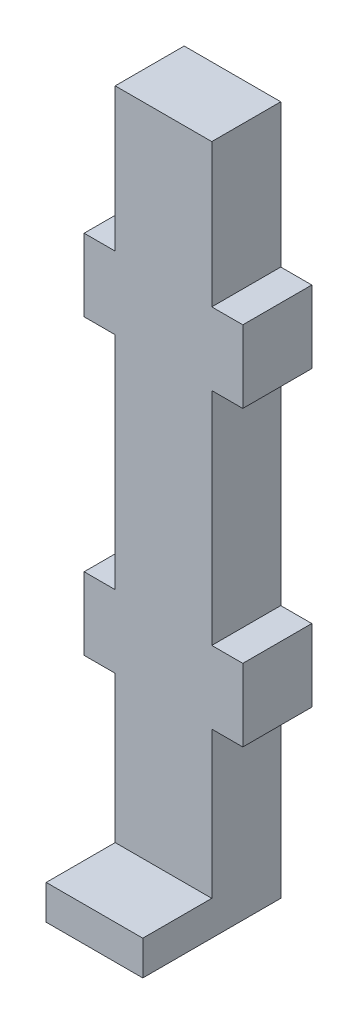
ISO-10303-21;
HEADER;
FILE_DESCRIPTION(('STEP AP214'),'2;1');
FILE_NAME('part.step','',(''),(''),'','','');
FILE_SCHEMA(('AUTOMOTIVE_DESIGN { 1 0 10303 214 1 1 1 1 }'));
ENDSEC;
DATA;
#1=APPLICATION_CONTEXT('core data for automotive mechanical design processes');
#2=APPLICATION_PROTOCOL_DEFINITION('international standard','automotive_design',2000,#1);
#3=PRODUCT_CONTEXT('',#1,'mechanical');
#4=PRODUCT('Part','Part','',(#3));
#5=PRODUCT_RELATED_PRODUCT_CATEGORY('part','',(#4));
#6=PRODUCT_DEFINITION_FORMATION('','',#4);
#7=PRODUCT_DEFINITION_CONTEXT('part definition',#1,'design');
#8=PRODUCT_DEFINITION('design','',#6,#7);
#9=PRODUCT_DEFINITION_SHAPE('','',#8);
#10=(LENGTH_UNIT() NAMED_UNIT(*) SI_UNIT(.MILLI.,.METRE.));
#11=(NAMED_UNIT(*) PLANE_ANGLE_UNIT() SI_UNIT($,.RADIAN.));
#12=(NAMED_UNIT(*) SI_UNIT($,.STERADIAN.) SOLID_ANGLE_UNIT());
#13=UNCERTAINTY_MEASURE_WITH_UNIT(LENGTH_MEASURE(1.E-05),#10,'distance_accuracy_value','');
#14=(GEOMETRIC_REPRESENTATION_CONTEXT(3) GLOBAL_UNCERTAINTY_ASSIGNED_CONTEXT((#13)) GLOBAL_UNIT_ASSIGNED_CONTEXT((#10,
#11,#12)) REPRESENTATION_CONTEXT('',''));
#15=CARTESIAN_POINT('',(0.,0.,0.));
#16=DIRECTION('',(0.,0.,1.));
#17=DIRECTION('',(1.,0.,0.));
#18=AXIS2_PLACEMENT_3D('',#15,#16,#17);
#19=CARTESIAN_POINT('',(2.8,-20.,4.));
#20=DIRECTION('',(-1.,0.,0.));
#21=DIRECTION('',(0.,0.,1.));
#22=AXIS2_PLACEMENT_3D('',#19,#20,#21);
#23=PLANE('',#22);
#24=DIRECTION('',(0.,0.,1.));
#25=VECTOR('',#24,1.);
#26=CARTESIAN_POINT('',(2.8,-5.3,0.));
#27=LINE('',#26,#25);
#28=CARTESIAN_POINT('',(2.8,-5.3,0.));
#29=VERTEX_POINT('',#28);
#30=CARTESIAN_POINT('',(2.8,-5.3,4.));
#31=VERTEX_POINT('',#30);
#32=EDGE_CURVE('E432',#29,#31,#27,.T.);
#33=ORIENTED_EDGE('',*,*,#32,.F.);
#34=DIRECTION('',(0.,1.,0.));
#35=VECTOR('',#34,1.);
#36=CARTESIAN_POINT('',(2.8,-20.,0.));
#37=LINE('',#36,#35);
#38=CARTESIAN_POINT('',(2.8,7.5,0.));
#39=VERTEX_POINT('',#38);
#40=EDGE_CURVE('E222',#29,#39,#37,.T.);
#41=ORIENTED_EDGE('',*,*,#40,.T.);
#42=DIRECTION('',(0.,0.,1.));
#43=VECTOR('',#42,1.);
#44=CARTESIAN_POINT('',(2.8,7.5,0.));
#45=LINE('',#44,#43);
#46=CARTESIAN_POINT('',(2.8,7.5,4.));
#47=VERTEX_POINT('',#46);
#48=EDGE_CURVE('E273',#39,#47,#45,.T.);
#49=ORIENTED_EDGE('',*,*,#48,.T.);
#50=DIRECTION('',(0.,1.,0.));
#51=VECTOR('',#50,1.);
#52=CARTESIAN_POINT('',(2.8,-20.,4.));
#53=LINE('',#52,#51);
#54=EDGE_CURVE('E61',#31,#47,#53,.T.);
#55=ORIENTED_EDGE('',*,*,#54,.F.);
#56=EDGE_LOOP('',(#33,#41,#49,#55));
#57=FACE_BOUND('',#56,.T.);
#58=ADVANCED_FACE('F45',(#57),#23,.F.);
#59=DIRECTION('',(0.,0.,-1.));
#60=VECTOR('',#59,1.);
#61=CARTESIAN_POINT('',(2.8,-9.5,0.));
#62=LINE('',#61,#60);
#63=CARTESIAN_POINT('',(2.8,-9.5,4.));
#64=VERTEX_POINT('',#63);
#65=CARTESIAN_POINT('',(2.8,-9.5,0.));
#66=VERTEX_POINT('',#65);
#67=EDGE_CURVE('E69',#64,#66,#62,.T.);
#68=ORIENTED_EDGE('',*,*,#67,.F.);
#69=CARTESIAN_POINT('',(2.8,-18.,4.));
#70=VERTEX_POINT('',#69);
#71=EDGE_CURVE('E367',#70,#64,#53,.T.);
#72=ORIENTED_EDGE('',*,*,#71,.F.);
#73=DIRECTION('',(0.,0.,-1.));
#74=VECTOR('',#73,1.);
#75=CARTESIAN_POINT('',(2.8,-18.,8.));
#76=LINE('',#75,#74);
#77=CARTESIAN_POINT('',(2.8,-18.,8.));
#78=VERTEX_POINT('',#77);
#79=EDGE_CURVE('E362',#78,#70,#76,.T.);
#80=ORIENTED_EDGE('',*,*,#79,.F.);
#81=DIRECTION('',(0.,1.,0.));
#82=VECTOR('',#81,1.);
#83=CARTESIAN_POINT('',(2.8,-20.,8.));
#84=LINE('',#83,#82);
#85=CARTESIAN_POINT('',(2.8,-20.,8.));
#86=VERTEX_POINT('',#85);
#87=EDGE_CURVE('E349',#86,#78,#84,.T.);
#88=ORIENTED_EDGE('',*,*,#87,.F.);
#89=DIRECTION('',(0.,0.,-1.));
#90=VECTOR('',#89,1.);
#91=CARTESIAN_POINT('',(2.8,-20.,4.));
#92=LINE('',#91,#90);
#93=CARTESIAN_POINT('',(2.8,-20.,0.));
#94=VERTEX_POINT('',#93);
#95=EDGE_CURVE('E11',#86,#94,#92,.T.);
#96=ORIENTED_EDGE('',*,*,#95,.T.);
#97=EDGE_CURVE('E386',#94,#66,#37,.T.);
#98=ORIENTED_EDGE('',*,*,#97,.T.);
#99=EDGE_LOOP('',(#68,#72,#80,#88,#96,#98));
#100=FACE_BOUND('',#99,.T.);
#101=ADVANCED_FACE('F484',(#100),#23,.F.);
#102=CARTESIAN_POINT('',(-2.8,-20.,4.));
#103=DIRECTION('',(-1.,0.,0.));
#104=DIRECTION('',(0.,0.,1.));
#105=AXIS2_PLACEMENT_3D('',#102,#103,#104);
#106=PLANE('',#105);
#107=DIRECTION('',(0.,0.,-1.));
#108=VECTOR('',#107,1.);
#109=CARTESIAN_POINT('',(-2.8,-9.5,0.));
#110=LINE('',#109,#108);
#111=CARTESIAN_POINT('',(-2.8,-9.5,4.));
#112=VERTEX_POINT('',#111);
#113=CARTESIAN_POINT('',(-2.8,-9.5,0.));
#114=VERTEX_POINT('',#113);
#115=EDGE_CURVE('E224',#112,#114,#110,.T.);
#116=ORIENTED_EDGE('',*,*,#115,.T.);
#117=DIRECTION('',(0.,1.,0.));
#118=VECTOR('',#117,1.);
#119=CARTESIAN_POINT('',(-2.8,-20.,0.));
#120=LINE('',#119,#118);
#121=CARTESIAN_POINT('',(-2.8,-20.,0.));
#122=VERTEX_POINT('',#121);
#123=EDGE_CURVE('E394',#122,#114,#120,.T.);
#124=ORIENTED_EDGE('',*,*,#123,.F.);
#125=DIRECTION('',(0.,0.,-1.));
#126=VECTOR('',#125,1.);
#127=CARTESIAN_POINT('',(-2.8,-20.,4.));
#128=LINE('',#127,#126);
#129=CARTESIAN_POINT('',(-2.8,-20.,8.));
#130=VERTEX_POINT('',#129);
#131=EDGE_CURVE('E380',#130,#122,#128,.T.);
#132=ORIENTED_EDGE('',*,*,#131,.F.);
#133=DIRECTION('',(0.,-1.,0.));
#134=VECTOR('',#133,1.);
#135=CARTESIAN_POINT('',(-2.8,-20.,8.));
#136=LINE('',#135,#134);
#137=CARTESIAN_POINT('',(-2.8,-18.,8.));
#138=VERTEX_POINT('',#137);
#139=EDGE_CURVE('E341',#138,#130,#136,.T.);
#140=ORIENTED_EDGE('',*,*,#139,.F.);
#141=DIRECTION('',(0.,0.,-1.));
#142=VECTOR('',#141,1.);
#143=CARTESIAN_POINT('',(-2.8,-18.,8.));
#144=LINE('',#143,#142);
#145=CARTESIAN_POINT('',(-2.8,-18.,4.));
#146=VERTEX_POINT('',#145);
#147=EDGE_CURVE('E355',#138,#146,#144,.T.);
#148=ORIENTED_EDGE('',*,*,#147,.T.);
#149=DIRECTION('',(0.,1.,0.));
#150=VECTOR('',#149,1.);
#151=CARTESIAN_POINT('',(-2.8,-20.,4.));
#152=LINE('',#151,#150);
#153=EDGE_CURVE('E376',#146,#112,#152,.T.);
#154=ORIENTED_EDGE('',*,*,#153,.T.);
#155=EDGE_LOOP('',(#116,#124,#132,#140,#148,#154));
#156=FACE_BOUND('',#155,.T.);
#157=ADVANCED_FACE('F478',(#156),#106,.T.);
#158=DIRECTION('',(0.,0.,-1.));
#159=VECTOR('',#158,1.);
#160=CARTESIAN_POINT('',(-2.8,11.7,0.));
#161=LINE('',#160,#159);
#162=CARTESIAN_POINT('',(-2.8,11.7,4.));
#163=VERTEX_POINT('',#162);
#164=CARTESIAN_POINT('',(-2.8,11.7,0.));
#165=VERTEX_POINT('',#164);
#166=EDGE_CURVE('E309',#163,#165,#161,.T.);
#167=ORIENTED_EDGE('',*,*,#166,.F.);
#168=CARTESIAN_POINT('',(-2.8,20.,4.));
#169=VERTEX_POINT('',#168);
#170=EDGE_CURVE('E375',#163,#169,#152,.T.);
#171=ORIENTED_EDGE('',*,*,#170,.T.);
#172=DIRECTION('',(0.,0.,-1.));
#173=VECTOR('',#172,1.);
#174=CARTESIAN_POINT('',(-2.8,20.,4.));
#175=LINE('',#174,#173);
#176=CARTESIAN_POINT('',(-2.8,20.,0.));
#177=VERTEX_POINT('',#176);
#178=EDGE_CURVE('E401',#169,#177,#175,.T.);
#179=ORIENTED_EDGE('',*,*,#178,.T.);
#180=EDGE_CURVE('E393',#165,#177,#120,.T.);
#181=ORIENTED_EDGE('',*,*,#180,.F.);
#182=EDGE_LOOP('',(#167,#171,#179,#181));
#183=FACE_BOUND('',#182,.T.);
#184=ADVANCED_FACE('F419',(#183),#106,.T.);
#185=CARTESIAN_POINT('',(-2.8,-20.,4.));
#186=DIRECTION('',(0.,1.,0.));
#187=DIRECTION('',(0.,0.,1.));
#188=AXIS2_PLACEMENT_3D('',#185,#186,#187);
#189=PLANE('',#188);
#190=DIRECTION('',(1.,0.,0.));
#191=VECTOR('',#190,1.);
#192=CARTESIAN_POINT('',(-2.8,-20.,0.));
#193=LINE('',#192,#191);
#194=EDGE_CURVE('E366',#122,#94,#193,.T.);
#195=ORIENTED_EDGE('',*,*,#194,.T.);
#196=ORIENTED_EDGE('',*,*,#95,.F.);
#197=DIRECTION('',(1.,0.,0.));
#198=VECTOR('',#197,1.);
#199=CARTESIAN_POINT('',(-2.8,-20.,8.));
#200=LINE('',#199,#198);
#201=EDGE_CURVE('E345',#130,#86,#200,.T.);
#202=ORIENTED_EDGE('',*,*,#201,.F.);
#203=ORIENTED_EDGE('',*,*,#131,.T.);
#204=EDGE_LOOP('',(#195,#196,#202,#203));
#205=FACE_BOUND('',#204,.T.);
#206=ADVANCED_FACE('F47',(#205),#189,.F.);
#207=CARTESIAN_POINT('',(2.8,11.7,4.));
#208=VERTEX_POINT('',#207);
#209=CARTESIAN_POINT('',(2.8,20.,4.));
#210=VERTEX_POINT('',#209);
#211=EDGE_CURVE('E371',#208,#210,#53,.T.);
#212=ORIENTED_EDGE('',*,*,#211,.F.);
#213=DIRECTION('',(0.,0.,-1.));
#214=VECTOR('',#213,1.);
#215=CARTESIAN_POINT('',(2.8,11.7,0.));
#216=LINE('',#215,#214);
#217=CARTESIAN_POINT('',(2.8,11.7,0.));
#218=VERTEX_POINT('',#217);
#219=EDGE_CURVE('E267',#208,#218,#216,.T.);
#220=ORIENTED_EDGE('',*,*,#219,.T.);
#221=CARTESIAN_POINT('',(2.8,20.,0.));
#222=VERTEX_POINT('',#221);
#223=EDGE_CURVE('E385',#218,#222,#37,.T.);
#224=ORIENTED_EDGE('',*,*,#223,.T.);
#225=DIRECTION('',(0.,0.,-1.));
#226=VECTOR('',#225,1.);
#227=CARTESIAN_POINT('',(2.8,20.,4.));
#228=LINE('',#227,#226);
#229=EDGE_CURVE('E54',#210,#222,#228,.T.);
#230=ORIENTED_EDGE('',*,*,#229,.F.);
#231=EDGE_LOOP('',(#212,#220,#224,#230));
#232=FACE_BOUND('',#231,.T.);
#233=ADVANCED_FACE('F440',(#232),#23,.F.);
#234=CARTESIAN_POINT('',(-2.8,20.,4.));
#235=DIRECTION('',(0.,1.,0.));
#236=DIRECTION('',(0.,0.,1.));
#237=AXIS2_PLACEMENT_3D('',#234,#235,#236);
#238=PLANE('',#237);
#239=DIRECTION('',(1.,0.,0.));
#240=VECTOR('',#239,1.);
#241=CARTESIAN_POINT('',(-2.8,20.,0.));
#242=LINE('',#241,#240);
#243=EDGE_CURVE('E389',#177,#222,#242,.T.);
#244=ORIENTED_EDGE('',*,*,#243,.F.);
#245=ORIENTED_EDGE('',*,*,#178,.F.);
#246=DIRECTION('',(1.,0.,0.));
#247=VECTOR('',#246,1.);
#248=CARTESIAN_POINT('',(-2.8,20.,4.));
#249=LINE('',#248,#247);
#250=EDGE_CURVE('E370',#169,#210,#249,.T.);
#251=ORIENTED_EDGE('',*,*,#250,.T.);
#252=ORIENTED_EDGE('',*,*,#229,.T.);
#253=EDGE_LOOP('',(#244,#245,#251,#252));
#254=FACE_BOUND('',#253,.T.);
#255=ADVANCED_FACE('F409',(#254),#238,.T.);
#256=DIRECTION('',(0.,0.,1.));
#257=VECTOR('',#256,1.);
#258=CARTESIAN_POINT('',(-2.8,-5.3,0.));
#259=LINE('',#258,#257);
#260=CARTESIAN_POINT('',(-2.8,-5.3,0.));
#261=VERTEX_POINT('',#260);
#262=CARTESIAN_POINT('',(-2.8,-5.3,4.));
#263=VERTEX_POINT('',#262);
#264=EDGE_CURVE('E229',#261,#263,#259,.T.);
#265=ORIENTED_EDGE('',*,*,#264,.T.);
#266=CARTESIAN_POINT('',(-2.8,7.5,4.));
#267=VERTEX_POINT('',#266);
#268=EDGE_CURVE('E381',#263,#267,#152,.T.);
#269=ORIENTED_EDGE('',*,*,#268,.T.);
#270=DIRECTION('',(0.,0.,1.));
#271=VECTOR('',#270,1.);
#272=CARTESIAN_POINT('',(-2.8,7.5,0.));
#273=LINE('',#272,#271);
#274=CARTESIAN_POINT('',(-2.8,7.5,0.));
#275=VERTEX_POINT('',#274);
#276=EDGE_CURVE('E303',#275,#267,#273,.T.);
#277=ORIENTED_EDGE('',*,*,#276,.F.);
#278=EDGE_CURVE('E398',#261,#275,#120,.T.);
#279=ORIENTED_EDGE('',*,*,#278,.F.);
#280=EDGE_LOOP('',(#265,#269,#277,#279));
#281=FACE_BOUND('',#280,.T.);
#282=ADVANCED_FACE('F447',(#281),#106,.T.);
#283=CARTESIAN_POINT('',(0.,0.,4.));
#284=DIRECTION('',(0.,0.,1.));
#285=DIRECTION('',(1.,0.,0.));
#286=AXIS2_PLACEMENT_3D('',#283,#284,#285);
#287=PLANE('',#286);
#288=DIRECTION('',(-1.,0.,0.));
#289=VECTOR('',#288,1.);
#290=CARTESIAN_POINT('',(-2.8,-18.,4.));
#291=LINE('',#290,#289);
#292=EDGE_CURVE('E340',#70,#146,#291,.T.);
#293=ORIENTED_EDGE('',*,*,#292,.F.);
#294=ORIENTED_EDGE('',*,*,#71,.T.);
#295=DIRECTION('',(-1.,0.,0.));
#296=VECTOR('',#295,1.);
#297=CARTESIAN_POINT('',(4.6,-9.5,4.));
#298=LINE('',#297,#296);
#299=CARTESIAN_POINT('',(4.6,-9.5,4.));
#300=VERTEX_POINT('',#299);
#301=EDGE_CURVE('E231',#300,#64,#298,.T.);
#302=ORIENTED_EDGE('',*,*,#301,.F.);
#303=DIRECTION('',(0.,-1.,0.));
#304=VECTOR('',#303,1.);
#305=CARTESIAN_POINT('',(4.6,-9.5,4.));
#306=LINE('',#305,#304);
#307=CARTESIAN_POINT('',(4.6,-5.3,4.));
#308=VERTEX_POINT('',#307);
#309=EDGE_CURVE('E207',#308,#300,#306,.T.);
#310=ORIENTED_EDGE('',*,*,#309,.F.);
#311=DIRECTION('',(-1.,0.,0.));
#312=VECTOR('',#311,1.);
#313=CARTESIAN_POINT('',(4.6,-5.3,4.));
#314=LINE('',#313,#312);
#315=EDGE_CURVE('E203',#308,#31,#314,.T.);
#316=ORIENTED_EDGE('',*,*,#315,.T.);
#317=ORIENTED_EDGE('',*,*,#54,.T.);
#318=DIRECTION('',(-1.,0.,0.));
#319=VECTOR('',#318,1.);
#320=CARTESIAN_POINT('',(4.6,7.5,4.));
#321=LINE('',#320,#319);
#322=CARTESIAN_POINT('',(4.6,7.5,4.));
#323=VERTEX_POINT('',#322);
#324=EDGE_CURVE('E293',#323,#47,#321,.T.);
#325=ORIENTED_EDGE('',*,*,#324,.F.);
#326=DIRECTION('',(0.,1.,0.));
#327=VECTOR('',#326,1.);
#328=CARTESIAN_POINT('',(4.6,11.7,4.));
#329=LINE('',#328,#327);
#330=CARTESIAN_POINT('',(4.6,11.7,4.));
#331=VERTEX_POINT('',#330);
#332=EDGE_CURVE('E277',#323,#331,#329,.T.);
#333=ORIENTED_EDGE('',*,*,#332,.T.);
#334=DIRECTION('',(-1.,0.,0.));
#335=VECTOR('',#334,1.);
#336=CARTESIAN_POINT('',(4.6,11.7,4.));
#337=LINE('',#336,#335);
#338=EDGE_CURVE('E297',#331,#208,#337,.T.);
#339=ORIENTED_EDGE('',*,*,#338,.T.);
#340=ORIENTED_EDGE('',*,*,#211,.T.);
#341=ORIENTED_EDGE('',*,*,#250,.F.);
#342=ORIENTED_EDGE('',*,*,#170,.F.);
#343=DIRECTION('',(1.,0.,0.));
#344=VECTOR('',#343,1.);
#345=CARTESIAN_POINT('',(-4.6,11.7,4.));
#346=LINE('',#345,#344);
#347=CARTESIAN_POINT('',(-4.6,11.7,4.));
#348=VERTEX_POINT('',#347);
#349=EDGE_CURVE('E328',#348,#163,#346,.T.);
#350=ORIENTED_EDGE('',*,*,#349,.F.);
#351=DIRECTION('',(0.,1.,0.));
#352=VECTOR('',#351,1.);
#353=CARTESIAN_POINT('',(-4.6,11.7,4.));
#354=LINE('',#353,#352);
#355=CARTESIAN_POINT('',(-4.6,7.5,4.));
#356=VERTEX_POINT('',#355);
#357=EDGE_CURVE('E312',#356,#348,#354,.T.);
#358=ORIENTED_EDGE('',*,*,#357,.F.);
#359=DIRECTION('',(1.,0.,0.));
#360=VECTOR('',#359,1.);
#361=CARTESIAN_POINT('',(-4.6,7.5,4.));
#362=LINE('',#361,#360);
#363=EDGE_CURVE('E332',#356,#267,#362,.T.);
#364=ORIENTED_EDGE('',*,*,#363,.T.);
#365=ORIENTED_EDGE('',*,*,#268,.F.);
#366=DIRECTION('',(1.,0.,0.));
#367=VECTOR('',#366,1.);
#368=CARTESIAN_POINT('',(-4.6,-5.3,4.));
#369=LINE('',#368,#367);
#370=CARTESIAN_POINT('',(-4.6,-5.3,4.));
#371=VERTEX_POINT('',#370);
#372=EDGE_CURVE('E258',#371,#263,#369,.T.);
#373=ORIENTED_EDGE('',*,*,#372,.F.);
#374=DIRECTION('',(0.,-1.,0.));
#375=VECTOR('',#374,1.);
#376=CARTESIAN_POINT('',(-4.6,-9.5,4.));
#377=LINE('',#376,#375);
#378=CARTESIAN_POINT('',(-4.6,-9.5,4.));
#379=VERTEX_POINT('',#378);
#380=EDGE_CURVE('E243',#371,#379,#377,.T.);
#381=ORIENTED_EDGE('',*,*,#380,.T.);
#382=DIRECTION('',(1.,0.,0.));
#383=VECTOR('',#382,1.);
#384=CARTESIAN_POINT('',(-4.6,-9.5,4.));
#385=LINE('',#384,#383);
#386=EDGE_CURVE('E261',#379,#112,#385,.T.);
#387=ORIENTED_EDGE('',*,*,#386,.T.);
#388=ORIENTED_EDGE('',*,*,#153,.F.);
#389=EDGE_LOOP('',(#293,#294,#302,#310,#316,#317,#325,#333,#339,#340,#341,#342,#350,#358,#364,
#365,#373,#381,#387,#388));
#390=FACE_BOUND('',#389,.T.);
#391=ADVANCED_FACE('F422',(#390),#287,.T.);
#392=CARTESIAN_POINT('',(0.,0.,0.));
#393=DIRECTION('',(0.,0.,1.));
#394=DIRECTION('',(1.,0.,0.));
#395=AXIS2_PLACEMENT_3D('',#392,#393,#394);
#396=PLANE('',#395);
#397=ORIENTED_EDGE('',*,*,#194,.F.);
#398=ORIENTED_EDGE('',*,*,#123,.T.);
#399=DIRECTION('',(1.,0.,0.));
#400=VECTOR('',#399,1.);
#401=CARTESIAN_POINT('',(-4.6,-9.5,0.));
#402=LINE('',#401,#400);
#403=CARTESIAN_POINT('',(-4.6,-9.5,0.));
#404=VERTEX_POINT('',#403);
#405=EDGE_CURVE('E264',#404,#114,#402,.T.);
#406=ORIENTED_EDGE('',*,*,#405,.F.);
#407=DIRECTION('',(0.,1.,0.));
#408=VECTOR('',#407,1.);
#409=CARTESIAN_POINT('',(-4.6,-9.5,0.));
#410=LINE('',#409,#408);
#411=CARTESIAN_POINT('',(-4.6,-5.3,0.));
#412=VERTEX_POINT('',#411);
#413=EDGE_CURVE('E235',#404,#412,#410,.T.);
#414=ORIENTED_EDGE('',*,*,#413,.T.);
#415=DIRECTION('',(1.,0.,0.));
#416=VECTOR('',#415,1.);
#417=CARTESIAN_POINT('',(-4.6,-5.3,0.));
#418=LINE('',#417,#416);
#419=EDGE_CURVE('E250',#412,#261,#418,.T.);
#420=ORIENTED_EDGE('',*,*,#419,.T.);
#421=ORIENTED_EDGE('',*,*,#278,.T.);
#422=DIRECTION('',(1.,0.,0.));
#423=VECTOR('',#422,1.);
#424=CARTESIAN_POINT('',(-4.6,7.5,0.));
#425=LINE('',#424,#423);
#426=CARTESIAN_POINT('',(-4.6,7.5,0.));
#427=VERTEX_POINT('',#426);
#428=EDGE_CURVE('E336',#427,#275,#425,.T.);
#429=ORIENTED_EDGE('',*,*,#428,.F.);
#430=DIRECTION('',(0.,-1.,0.));
#431=VECTOR('',#430,1.);
#432=CARTESIAN_POINT('',(-4.6,11.7,0.));
#433=LINE('',#432,#431);
#434=CARTESIAN_POINT('',(-4.6,11.7,0.));
#435=VERTEX_POINT('',#434);
#436=EDGE_CURVE('E304',#435,#427,#433,.T.);
#437=ORIENTED_EDGE('',*,*,#436,.F.);
#438=DIRECTION('',(1.,0.,0.));
#439=VECTOR('',#438,1.);
#440=CARTESIAN_POINT('',(-4.6,11.7,0.));
#441=LINE('',#440,#439);
#442=EDGE_CURVE('E318',#435,#165,#441,.T.);
#443=ORIENTED_EDGE('',*,*,#442,.T.);
#444=ORIENTED_EDGE('',*,*,#180,.T.);
#445=ORIENTED_EDGE('',*,*,#243,.T.);
#446=ORIENTED_EDGE('',*,*,#223,.F.);
#447=DIRECTION('',(-1.,0.,0.));
#448=VECTOR('',#447,1.);
#449=CARTESIAN_POINT('',(4.6,11.7,0.));
#450=LINE('',#449,#448);
#451=CARTESIAN_POINT('',(4.6,11.7,0.));
#452=VERTEX_POINT('',#451);
#453=EDGE_CURVE('E300',#452,#218,#450,.T.);
#454=ORIENTED_EDGE('',*,*,#453,.F.);
#455=DIRECTION('',(0.,-1.,0.));
#456=VECTOR('',#455,1.);
#457=CARTESIAN_POINT('',(4.6,11.7,0.));
#458=LINE('',#457,#456);
#459=CARTESIAN_POINT('',(4.6,7.5,0.));
#460=VERTEX_POINT('',#459);
#461=EDGE_CURVE('E268',#452,#460,#458,.T.);
#462=ORIENTED_EDGE('',*,*,#461,.T.);
#463=DIRECTION('',(-1.,0.,0.));
#464=VECTOR('',#463,1.);
#465=CARTESIAN_POINT('',(4.6,7.5,0.));
#466=LINE('',#465,#464);
#467=EDGE_CURVE('E285',#460,#39,#466,.T.);
#468=ORIENTED_EDGE('',*,*,#467,.T.);
#469=ORIENTED_EDGE('',*,*,#40,.F.);
#470=DIRECTION('',(-1.,0.,0.));
#471=VECTOR('',#470,1.);
#472=CARTESIAN_POINT('',(4.6,-5.3,0.));
#473=LINE('',#472,#471);
#474=CARTESIAN_POINT('',(4.6,-5.3,0.));
#475=VERTEX_POINT('',#474);
#476=EDGE_CURVE('E201',#475,#29,#473,.T.);
#477=ORIENTED_EDGE('',*,*,#476,.F.);
#478=DIRECTION('',(0.,1.,0.));
#479=VECTOR('',#478,1.);
#480=CARTESIAN_POINT('',(4.6,-9.5,0.));
#481=LINE('',#480,#479);
#482=CARTESIAN_POINT('',(4.6,-9.5,0.));
#483=VERTEX_POINT('',#482);
#484=EDGE_CURVE('E208',#483,#475,#481,.T.);
#485=ORIENTED_EDGE('',*,*,#484,.F.);
#486=DIRECTION('',(-1.,0.,0.));
#487=VECTOR('',#486,1.);
#488=CARTESIAN_POINT('',(4.6,-9.5,0.));
#489=LINE('',#488,#487);
#490=EDGE_CURVE('E490',#483,#66,#489,.T.);
#491=ORIENTED_EDGE('',*,*,#490,.T.);
#492=ORIENTED_EDGE('',*,*,#97,.F.);
#493=EDGE_LOOP('',(#397,#398,#406,#414,#420,#421,#429,#437,#443,#444,#445,#446,#454,#462,#468,
#469,#477,#485,#491,#492));
#494=FACE_BOUND('',#493,.T.);
#495=ADVANCED_FACE('F220',(#494),#396,.F.);
#496=CARTESIAN_POINT('',(-2.8,-18.,8.));
#497=DIRECTION('',(0.,-1.,0.));
#498=DIRECTION('',(0.,0.,-1.));
#499=AXIS2_PLACEMENT_3D('',#496,#497,#498);
#500=PLANE('',#499);
#501=ORIENTED_EDGE('',*,*,#292,.T.);
#502=ORIENTED_EDGE('',*,*,#147,.F.);
#503=DIRECTION('',(-1.,0.,0.));
#504=VECTOR('',#503,1.);
#505=CARTESIAN_POINT('',(-2.8,-18.,8.));
#506=LINE('',#505,#504);
#507=EDGE_CURVE('E352',#78,#138,#506,.T.);
#508=ORIENTED_EDGE('',*,*,#507,.F.);
#509=ORIENTED_EDGE('',*,*,#79,.T.);
#510=EDGE_LOOP('',(#501,#502,#508,#509));
#511=FACE_BOUND('',#510,.T.);
#512=ADVANCED_FACE('F474',(#511),#500,.F.);
#513=CARTESIAN_POINT('',(0.,0.,8.));
#514=DIRECTION('',(0.,0.,-1.));
#515=DIRECTION('',(-1.,0.,0.));
#516=AXIS2_PLACEMENT_3D('',#513,#514,#515);
#517=PLANE('',#516);
#518=ORIENTED_EDGE('',*,*,#139,.T.);
#519=ORIENTED_EDGE('',*,*,#201,.T.);
#520=ORIENTED_EDGE('',*,*,#87,.T.);
#521=ORIENTED_EDGE('',*,*,#507,.T.);
#522=EDGE_LOOP('',(#518,#519,#520,#521));
#523=FACE_BOUND('',#522,.T.);
#524=ADVANCED_FACE('F482',(#523),#517,.F.);
#525=CARTESIAN_POINT('',(-4.6,7.5,0.));
#526=DIRECTION('',(0.,1.,0.));
#527=DIRECTION('',(0.,0.,1.));
#528=AXIS2_PLACEMENT_3D('',#525,#526,#527);
#529=PLANE('',#528);
#530=ORIENTED_EDGE('',*,*,#276,.T.);
#531=ORIENTED_EDGE('',*,*,#363,.F.);
#532=DIRECTION('',(0.,0.,1.));
#533=VECTOR('',#532,1.);
#534=CARTESIAN_POINT('',(-4.6,7.5,0.));
#535=LINE('',#534,#533);
#536=EDGE_CURVE('E308',#427,#356,#535,.T.);
#537=ORIENTED_EDGE('',*,*,#536,.F.);
#538=ORIENTED_EDGE('',*,*,#428,.T.);
#539=EDGE_LOOP('',(#530,#531,#537,#538));
#540=FACE_BOUND('',#539,.T.);
#541=ADVANCED_FACE('F451',(#540),#529,.F.);
#542=CARTESIAN_POINT('',(-4.6,11.7,0.));
#543=DIRECTION('',(0.,-1.,0.));
#544=DIRECTION('',(0.,0.,-1.));
#545=AXIS2_PLACEMENT_3D('',#542,#543,#544);
#546=PLANE('',#545);
#547=ORIENTED_EDGE('',*,*,#166,.T.);
#548=ORIENTED_EDGE('',*,*,#442,.F.);
#549=DIRECTION('',(0.,0.,-1.));
#550=VECTOR('',#549,1.);
#551=CARTESIAN_POINT('',(-4.6,11.7,0.));
#552=LINE('',#551,#550);
#553=EDGE_CURVE('E315',#348,#435,#552,.T.);
#554=ORIENTED_EDGE('',*,*,#553,.F.);
#555=ORIENTED_EDGE('',*,*,#349,.T.);
#556=EDGE_LOOP('',(#547,#548,#554,#555));
#557=FACE_BOUND('',#556,.T.);
#558=ADVANCED_FACE('F457',(#557),#546,.F.);
#559=CARTESIAN_POINT('',(-4.6,0.,0.));
#560=DIRECTION('',(-1.,0.,0.));
#561=DIRECTION('',(0.,0.,1.));
#562=AXIS2_PLACEMENT_3D('',#559,#560,#561);
#563=PLANE('',#562);
#564=ORIENTED_EDGE('',*,*,#436,.T.);
#565=ORIENTED_EDGE('',*,*,#536,.T.);
#566=ORIENTED_EDGE('',*,*,#357,.T.);
#567=ORIENTED_EDGE('',*,*,#553,.T.);
#568=EDGE_LOOP('',(#564,#565,#566,#567));
#569=FACE_BOUND('',#568,.T.);
#570=ADVANCED_FACE('F454',(#569),#563,.T.);
#571=CARTESIAN_POINT('',(4.6,11.7,0.));
#572=DIRECTION('',(0.,1.,0.));
#573=DIRECTION('',(0.,0.,1.));
#574=AXIS2_PLACEMENT_3D('',#571,#572,#573);
#575=PLANE('',#574);
#576=ORIENTED_EDGE('',*,*,#219,.F.);
#577=ORIENTED_EDGE('',*,*,#338,.F.);
#578=DIRECTION('',(0.,0.,-1.));
#579=VECTOR('',#578,1.);
#580=CARTESIAN_POINT('',(4.6,11.7,0.));
#581=LINE('',#580,#579);
#582=EDGE_CURVE('E272',#331,#452,#581,.T.);
#583=ORIENTED_EDGE('',*,*,#582,.T.);
#584=ORIENTED_EDGE('',*,*,#453,.T.);
#585=EDGE_LOOP('',(#576,#577,#583,#584));
#586=FACE_BOUND('',#585,.T.);
#587=ADVANCED_FACE('F439',(#586),#575,.T.);
#588=CARTESIAN_POINT('',(4.6,7.5,0.));
#589=DIRECTION('',(0.,-1.,0.));
#590=DIRECTION('',(0.,0.,-1.));
#591=AXIS2_PLACEMENT_3D('',#588,#589,#590);
#592=PLANE('',#591);
#593=ORIENTED_EDGE('',*,*,#48,.F.);
#594=ORIENTED_EDGE('',*,*,#467,.F.);
#595=DIRECTION('',(0.,0.,1.));
#596=VECTOR('',#595,1.);
#597=CARTESIAN_POINT('',(4.6,7.5,0.));
#598=LINE('',#597,#596);
#599=EDGE_CURVE('E281',#460,#323,#598,.T.);
#600=ORIENTED_EDGE('',*,*,#599,.T.);
#601=ORIENTED_EDGE('',*,*,#324,.T.);
#602=EDGE_LOOP('',(#593,#594,#600,#601));
#603=FACE_BOUND('',#602,.T.);
#604=ADVANCED_FACE('F430',(#603),#592,.T.);
#605=CARTESIAN_POINT('',(4.6,0.,0.));
#606=DIRECTION('',(1.,0.,0.));
#607=DIRECTION('',(0.,0.,1.));
#608=AXIS2_PLACEMENT_3D('',#605,#606,#607);
#609=PLANE('',#608);
#610=ORIENTED_EDGE('',*,*,#461,.F.);
#611=ORIENTED_EDGE('',*,*,#582,.F.);
#612=ORIENTED_EDGE('',*,*,#332,.F.);
#613=ORIENTED_EDGE('',*,*,#599,.F.);
#614=EDGE_LOOP('',(#610,#611,#612,#613));
#615=FACE_BOUND('',#614,.T.);
#616=ADVANCED_FACE('F437',(#615),#609,.T.);
#617=CARTESIAN_POINT('',(-4.6,-9.5,0.));
#618=DIRECTION('',(0.,-1.,0.));
#619=DIRECTION('',(0.,0.,-1.));
#620=AXIS2_PLACEMENT_3D('',#617,#618,#619);
#621=PLANE('',#620);
#622=ORIENTED_EDGE('',*,*,#115,.F.);
#623=ORIENTED_EDGE('',*,*,#386,.F.);
#624=DIRECTION('',(0.,0.,-1.));
#625=VECTOR('',#624,1.);
#626=CARTESIAN_POINT('',(-4.6,-9.5,0.));
#627=LINE('',#626,#625);
#628=EDGE_CURVE('E239',#379,#404,#627,.T.);
#629=ORIENTED_EDGE('',*,*,#628,.T.);
#630=ORIENTED_EDGE('',*,*,#405,.T.);
#631=EDGE_LOOP('',(#622,#623,#629,#630));
#632=FACE_BOUND('',#631,.T.);
#633=ADVANCED_FACE('F470',(#632),#621,.T.);
#634=CARTESIAN_POINT('',(-4.6,-5.3,0.));
#635=DIRECTION('',(0.,1.,0.));
#636=DIRECTION('',(0.,0.,1.));
#637=AXIS2_PLACEMENT_3D('',#634,#635,#636);
#638=PLANE('',#637);
#639=ORIENTED_EDGE('',*,*,#264,.F.);
#640=ORIENTED_EDGE('',*,*,#419,.F.);
#641=DIRECTION('',(0.,0.,1.));
#642=VECTOR('',#641,1.);
#643=CARTESIAN_POINT('',(-4.6,-5.3,0.));
#644=LINE('',#643,#642);
#645=EDGE_CURVE('E247',#412,#371,#644,.T.);
#646=ORIENTED_EDGE('',*,*,#645,.T.);
#647=ORIENTED_EDGE('',*,*,#372,.T.);
#648=EDGE_LOOP('',(#639,#640,#646,#647));
#649=FACE_BOUND('',#648,.T.);
#650=ADVANCED_FACE('F467',(#649),#638,.T.);
#651=CARTESIAN_POINT('',(-4.6,2.2,0.));
#652=DIRECTION('',(-1.,0.,0.));
#653=DIRECTION('',(0.,0.,1.));
#654=AXIS2_PLACEMENT_3D('',#651,#652,#653);
#655=PLANE('',#654);
#656=ORIENTED_EDGE('',*,*,#413,.F.);
#657=ORIENTED_EDGE('',*,*,#628,.F.);
#658=ORIENTED_EDGE('',*,*,#380,.F.);
#659=ORIENTED_EDGE('',*,*,#645,.F.);
#660=EDGE_LOOP('',(#656,#657,#658,#659));
#661=FACE_BOUND('',#660,.T.);
#662=ADVANCED_FACE('F466',(#661),#655,.T.);
#663=CARTESIAN_POINT('',(4.6,-5.3,0.));
#664=DIRECTION('',(0.,-1.,0.));
#665=DIRECTION('',(0.,0.,-1.));
#666=AXIS2_PLACEMENT_3D('',#663,#664,#665);
#667=PLANE('',#666);
#668=ORIENTED_EDGE('',*,*,#32,.T.);
#669=ORIENTED_EDGE('',*,*,#315,.F.);
#670=DIRECTION('',(0.,0.,1.));
#671=VECTOR('',#670,1.);
#672=CARTESIAN_POINT('',(4.6,-5.3,0.));
#673=LINE('',#672,#671);
#674=EDGE_CURVE('E197',#475,#308,#673,.T.);
#675=ORIENTED_EDGE('',*,*,#674,.F.);
#676=ORIENTED_EDGE('',*,*,#476,.T.);
#677=EDGE_LOOP('',(#668,#669,#675,#676));
#678=FACE_BOUND('',#677,.T.);
#679=ADVANCED_FACE('F199',(#678),#667,.F.);
#680=CARTESIAN_POINT('',(4.6,-9.5,0.));
#681=DIRECTION('',(0.,1.,0.));
#682=DIRECTION('',(0.,0.,1.));
#683=AXIS2_PLACEMENT_3D('',#680,#681,#682);
#684=PLANE('',#683);
#685=ORIENTED_EDGE('',*,*,#67,.T.);
#686=ORIENTED_EDGE('',*,*,#490,.F.);
#687=DIRECTION('',(0.,0.,-1.));
#688=VECTOR('',#687,1.);
#689=CARTESIAN_POINT('',(4.6,-9.5,0.));
#690=LINE('',#689,#688);
#691=EDGE_CURVE('E213',#300,#483,#690,.T.);
#692=ORIENTED_EDGE('',*,*,#691,.F.);
#693=ORIENTED_EDGE('',*,*,#301,.T.);
#694=EDGE_LOOP('',(#685,#686,#692,#693));
#695=FACE_BOUND('',#694,.T.);
#696=ADVANCED_FACE('F488',(#695),#684,.F.);
#697=CARTESIAN_POINT('',(4.6,2.2,0.));
#698=DIRECTION('',(1.,0.,0.));
#699=DIRECTION('',(0.,0.,1.));
#700=AXIS2_PLACEMENT_3D('',#697,#698,#699);
#701=PLANE('',#700);
#702=ORIENTED_EDGE('',*,*,#484,.T.);
#703=ORIENTED_EDGE('',*,*,#674,.T.);
#704=ORIENTED_EDGE('',*,*,#309,.T.);
#705=ORIENTED_EDGE('',*,*,#691,.T.);
#706=EDGE_LOOP('',(#702,#703,#704,#705));
#707=FACE_BOUND('',#706,.T.);
#708=ADVANCED_FACE('F211',(#707),#701,.T.);
#709=CLOSED_SHELL('',(#58,#101,#157,#184,#206,#233,#255,#282,#391,#495,#512,#524,#541,#558,#570,
#587,#604,#616,#633,#650,#662,#679,#696,#708));
#710=MANIFOLD_SOLID_BREP('B2',#709);
#711=ADVANCED_BREP_SHAPE_REPRESENTATION('',(#18,#710),#14);
#712=SHAPE_DEFINITION_REPRESENTATION(#9,#711);
ENDSEC;
END-ISO-10303-21;
